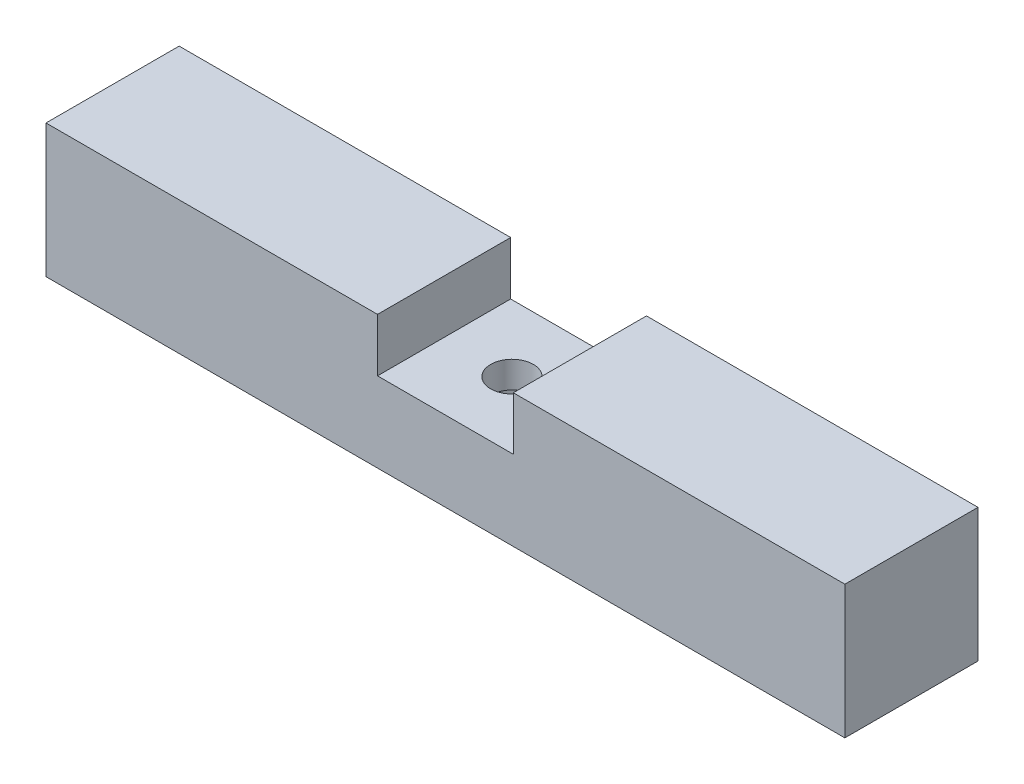
ISO-10303-21;
HEADER;
FILE_DESCRIPTION(('STEP AP214'),'2;1');
FILE_NAME('part.step','',(''),(''),'','','');
FILE_SCHEMA(('AUTOMOTIVE_DESIGN { 1 0 10303 214 1 1 1 1 }'));
ENDSEC;
DATA;
#1=APPLICATION_CONTEXT('core data for automotive mechanical design processes');
#2=APPLICATION_PROTOCOL_DEFINITION('international standard','automotive_design',2000,#1);
#3=PRODUCT_CONTEXT('',#1,'mechanical');
#4=PRODUCT('Part','Part','',(#3));
#5=PRODUCT_RELATED_PRODUCT_CATEGORY('part','',(#4));
#6=PRODUCT_DEFINITION_FORMATION('','',#4);
#7=PRODUCT_DEFINITION_CONTEXT('part definition',#1,'design');
#8=PRODUCT_DEFINITION('design','',#6,#7);
#9=PRODUCT_DEFINITION_SHAPE('','',#8);
#10=(LENGTH_UNIT() NAMED_UNIT(*) SI_UNIT(.MILLI.,.METRE.));
#11=(NAMED_UNIT(*) PLANE_ANGLE_UNIT() SI_UNIT($,.RADIAN.));
#12=(NAMED_UNIT(*) SI_UNIT($,.STERADIAN.) SOLID_ANGLE_UNIT());
#13=UNCERTAINTY_MEASURE_WITH_UNIT(LENGTH_MEASURE(1.E-05),#10,'distance_accuracy_value','');
#14=(GEOMETRIC_REPRESENTATION_CONTEXT(3) GLOBAL_UNCERTAINTY_ASSIGNED_CONTEXT((#13)) GLOBAL_UNIT_ASSIGNED_CONTEXT((#10,
#11,#12)) REPRESENTATION_CONTEXT('',''));
#15=CARTESIAN_POINT('',(0.,0.,0.));
#16=DIRECTION('',(0.,0.,1.));
#17=DIRECTION('',(1.,0.,0.));
#18=AXIS2_PLACEMENT_3D('',#15,#16,#17);
#19=CARTESIAN_POINT('',(0.,-4.,5.));
#20=DIRECTION('',(0.,1.,0.));
#21=DIRECTION('',(0.,0.,1.));
#22=AXIS2_PLACEMENT_3D('',#19,#20,#21);
#23=CYLINDRICAL_SURFACE('',#22,1.6);
#24=CARTESIAN_POINT('',(0.,6.,5.));
#25=DIRECTION('',(0.,1.,0.));
#26=DIRECTION('',(0.,0.,1.));
#27=AXIS2_PLACEMENT_3D('',#24,#25,#26);
#28=CIRCLE('',#27,1.6);
#29=CARTESIAN_POINT('',(0.,6.,6.6));
#30=VERTEX_POINT('',#29);
#31=EDGE_CURVE('E135',#30,#30,#28,.T.);
#32=ORIENTED_EDGE('',*,*,#31,.T.);
#33=EDGE_LOOP('',(#32));
#34=FACE_BOUND('',#33,.T.);
#35=CARTESIAN_POINT('',(0.,4.,5.));
#36=DIRECTION('',(0.,-1.,0.));
#37=DIRECTION('',(1.,0.,0.));
#38=AXIS2_PLACEMENT_3D('',#35,#36,#37);
#39=CIRCLE('',#38,1.6);
#40=CARTESIAN_POINT('',(1.6,4.,5.));
#41=VERTEX_POINT('',#40);
#42=EDGE_CURVE('E37',#41,#41,#39,.F.);
#43=ORIENTED_EDGE('',*,*,#42,.F.);
#44=EDGE_LOOP('',(#43));
#45=FACE_BOUND('',#44,.T.);
#46=ADVANCED_FACE('F33',(#34,#45),#23,.F.);
#47=CARTESIAN_POINT('',(-30.,0.,10.));
#48=DIRECTION('',(1.,0.,0.));
#49=DIRECTION('',(0.,0.,-1.));
#50=AXIS2_PLACEMENT_3D('',#47,#48,#49);
#51=PLANE('',#50);
#52=DIRECTION('',(0.,-1.,0.));
#53=VECTOR('',#52,1.);
#54=CARTESIAN_POINT('',(-30.,0.,0.));
#55=LINE('',#54,#53);
#56=CARTESIAN_POINT('',(-30.,10.,0.));
#57=VERTEX_POINT('',#56);
#58=CARTESIAN_POINT('',(-30.,0.,0.));
#59=VERTEX_POINT('',#58);
#60=EDGE_CURVE('E131',#57,#59,#55,.T.);
#61=ORIENTED_EDGE('',*,*,#60,.T.);
#62=DIRECTION('',(0.,0.,-1.));
#63=VECTOR('',#62,1.);
#64=CARTESIAN_POINT('',(-30.,0.,10.));
#65=LINE('',#64,#63);
#66=CARTESIAN_POINT('',(-30.,0.,10.));
#67=VERTEX_POINT('',#66);
#68=EDGE_CURVE('E11',#67,#59,#65,.T.);
#69=ORIENTED_EDGE('',*,*,#68,.F.);
#70=DIRECTION('',(0.,-1.,0.));
#71=VECTOR('',#70,1.);
#72=CARTESIAN_POINT('',(-30.,0.,10.));
#73=LINE('',#72,#71);
#74=CARTESIAN_POINT('',(-30.,10.,10.));
#75=VERTEX_POINT('',#74);
#76=EDGE_CURVE('E146',#75,#67,#73,.T.);
#77=ORIENTED_EDGE('',*,*,#76,.F.);
#78=DIRECTION('',(0.,0.,-1.));
#79=VECTOR('',#78,1.);
#80=CARTESIAN_POINT('',(-30.,10.,10.));
#81=LINE('',#80,#79);
#82=EDGE_CURVE('E127',#75,#57,#81,.T.);
#83=ORIENTED_EDGE('',*,*,#82,.T.);
#84=EDGE_LOOP('',(#61,#69,#77,#83));
#85=FACE_BOUND('',#84,.T.);
#86=ADVANCED_FACE('F35',(#85),#51,.F.);
#87=CARTESIAN_POINT('',(-30.,0.,10.));
#88=DIRECTION('',(0.,1.,0.));
#89=DIRECTION('',(-1.,0.,0.));
#90=AXIS2_PLACEMENT_3D('',#87,#88,#89);
#91=PLANE('',#90);
#92=CARTESIAN_POINT('',(0.,0.,5.));
#93=DIRECTION('',(0.,-1.,0.));
#94=DIRECTION('',(1.,0.,0.));
#95=AXIS2_PLACEMENT_3D('',#92,#93,#94);
#96=CIRCLE('',#95,3.);
#97=CARTESIAN_POINT('',(3.,0.,5.));
#98=VERTEX_POINT('',#97);
#99=EDGE_CURVE('E182',#98,#98,#96,.T.);
#100=ORIENTED_EDGE('',*,*,#99,.F.);
#101=EDGE_LOOP('',(#100));
#102=FACE_BOUND('',#101,.T.);
#103=DIRECTION('',(1.,0.,0.));
#104=VECTOR('',#103,1.);
#105=CARTESIAN_POINT('',(-30.,0.,0.));
#106=LINE('',#105,#104);
#107=CARTESIAN_POINT('',(30.,0.,0.));
#108=VERTEX_POINT('',#107);
#109=EDGE_CURVE('E134',#59,#108,#106,.T.);
#110=ORIENTED_EDGE('',*,*,#109,.T.);
#111=DIRECTION('',(0.,0.,-1.));
#112=VECTOR('',#111,1.);
#113=CARTESIAN_POINT('',(30.,0.,10.));
#114=LINE('',#113,#112);
#115=CARTESIAN_POINT('',(30.,0.,10.));
#116=VERTEX_POINT('',#115);
#117=EDGE_CURVE('E43',#116,#108,#114,.T.);
#118=ORIENTED_EDGE('',*,*,#117,.F.);
#119=DIRECTION('',(1.,0.,0.));
#120=VECTOR('',#119,1.);
#121=CARTESIAN_POINT('',(-30.,0.,10.));
#122=LINE('',#121,#120);
#123=EDGE_CURVE('E94',#67,#116,#122,.T.);
#124=ORIENTED_EDGE('',*,*,#123,.F.);
#125=ORIENTED_EDGE('',*,*,#68,.T.);
#126=EDGE_LOOP('',(#110,#118,#124,#125));
#127=FACE_BOUND('',#126,.T.);
#128=ADVANCED_FACE('F200',(#102,#127),#91,.F.);
#129=CARTESIAN_POINT('',(30.,0.,10.));
#130=DIRECTION('',(-1.,0.,0.));
#131=DIRECTION('',(0.,-1.,0.));
#132=AXIS2_PLACEMENT_3D('',#129,#130,#131);
#133=PLANE('',#132);
#134=DIRECTION('',(0.,1.,0.));
#135=VECTOR('',#134,1.);
#136=CARTESIAN_POINT('',(30.,0.,0.));
#137=LINE('',#136,#135);
#138=CARTESIAN_POINT('',(30.,10.,0.));
#139=VERTEX_POINT('',#138);
#140=EDGE_CURVE('E137',#108,#139,#137,.T.);
#141=ORIENTED_EDGE('',*,*,#140,.T.);
#142=DIRECTION('',(0.,0.,-1.));
#143=VECTOR('',#142,1.);
#144=CARTESIAN_POINT('',(30.,10.,10.));
#145=LINE('',#144,#143);
#146=CARTESIAN_POINT('',(30.,10.,10.));
#147=VERTEX_POINT('',#146);
#148=EDGE_CURVE('E153',#147,#139,#145,.T.);
#149=ORIENTED_EDGE('',*,*,#148,.F.);
#150=DIRECTION('',(0.,1.,0.));
#151=VECTOR('',#150,1.);
#152=CARTESIAN_POINT('',(30.,0.,10.));
#153=LINE('',#152,#151);
#154=EDGE_CURVE('E162',#116,#147,#153,.T.);
#155=ORIENTED_EDGE('',*,*,#154,.F.);
#156=ORIENTED_EDGE('',*,*,#117,.T.);
#157=EDGE_LOOP('',(#141,#149,#155,#156));
#158=FACE_BOUND('',#157,.T.);
#159=ADVANCED_FACE('F160',(#158),#133,.F.);
#160=CARTESIAN_POINT('',(5.1,10.,10.));
#161=DIRECTION('',(0.,-1.,0.));
#162=DIRECTION('',(1.,0.,0.));
#163=AXIS2_PLACEMENT_3D('',#160,#161,#162);
#164=PLANE('',#163);
#165=DIRECTION('',(-1.,0.,0.));
#166=VECTOR('',#165,1.);
#167=CARTESIAN_POINT('',(5.1,10.,0.));
#168=LINE('',#167,#166);
#169=CARTESIAN_POINT('',(5.1,10.,0.));
#170=VERTEX_POINT('',#169);
#171=EDGE_CURVE('E139',#139,#170,#168,.T.);
#172=ORIENTED_EDGE('',*,*,#171,.T.);
#173=DIRECTION('',(0.,0.,-1.));
#174=VECTOR('',#173,1.);
#175=CARTESIAN_POINT('',(5.1,10.,10.));
#176=LINE('',#175,#174);
#177=CARTESIAN_POINT('',(5.1,10.,10.));
#178=VERTEX_POINT('',#177);
#179=EDGE_CURVE('E150',#178,#170,#176,.T.);
#180=ORIENTED_EDGE('',*,*,#179,.F.);
#181=DIRECTION('',(-1.,0.,0.));
#182=VECTOR('',#181,1.);
#183=CARTESIAN_POINT('',(5.1,10.,10.));
#184=LINE('',#183,#182);
#185=EDGE_CURVE('E174',#147,#178,#184,.T.);
#186=ORIENTED_EDGE('',*,*,#185,.F.);
#187=ORIENTED_EDGE('',*,*,#148,.T.);
#188=EDGE_LOOP('',(#172,#180,#186,#187));
#189=FACE_BOUND('',#188,.T.);
#190=ADVANCED_FACE('F170',(#189),#164,.F.);
#191=CARTESIAN_POINT('',(5.1,6.,10.));
#192=DIRECTION('',(1.,0.,0.));
#193=DIRECTION('',(0.,1.,0.));
#194=AXIS2_PLACEMENT_3D('',#191,#192,#193);
#195=PLANE('',#194);
#196=DIRECTION('',(0.,-1.,0.));
#197=VECTOR('',#196,1.);
#198=CARTESIAN_POINT('',(5.1,6.,0.));
#199=LINE('',#198,#197);
#200=CARTESIAN_POINT('',(5.1,6.,0.));
#201=VERTEX_POINT('',#200);
#202=EDGE_CURVE('E141',#170,#201,#199,.T.);
#203=ORIENTED_EDGE('',*,*,#202,.T.);
#204=DIRECTION('',(0.,0.,-1.));
#205=VECTOR('',#204,1.);
#206=CARTESIAN_POINT('',(5.1,6.,10.));
#207=LINE('',#206,#205);
#208=CARTESIAN_POINT('',(5.1,6.,10.));
#209=VERTEX_POINT('',#208);
#210=EDGE_CURVE('E122',#209,#201,#207,.T.);
#211=ORIENTED_EDGE('',*,*,#210,.F.);
#212=DIRECTION('',(0.,-1.,0.));
#213=VECTOR('',#212,1.);
#214=CARTESIAN_POINT('',(5.1,6.,10.));
#215=LINE('',#214,#213);
#216=EDGE_CURVE('E113',#178,#209,#215,.T.);
#217=ORIENTED_EDGE('',*,*,#216,.F.);
#218=ORIENTED_EDGE('',*,*,#179,.T.);
#219=EDGE_LOOP('',(#203,#211,#217,#218));
#220=FACE_BOUND('',#219,.T.);
#221=ADVANCED_FACE('F173',(#220),#195,.F.);
#222=CARTESIAN_POINT('',(-5.1,6.,10.));
#223=DIRECTION('',(0.,-1.,0.));
#224=DIRECTION('',(1.,0.,0.));
#225=AXIS2_PLACEMENT_3D('',#222,#223,#224);
#226=PLANE('',#225);
#227=ORIENTED_EDGE('',*,*,#31,.F.);
#228=EDGE_LOOP('',(#227));
#229=FACE_BOUND('',#228,.T.);
#230=DIRECTION('',(-1.,0.,0.));
#231=VECTOR('',#230,1.);
#232=CARTESIAN_POINT('',(-5.1,6.,0.));
#233=LINE('',#232,#231);
#234=CARTESIAN_POINT('',(-5.1,6.,0.));
#235=VERTEX_POINT('',#234);
#236=EDGE_CURVE('E121',#201,#235,#233,.T.);
#237=ORIENTED_EDGE('',*,*,#236,.T.);
#238=DIRECTION('',(0.,0.,-1.));
#239=VECTOR('',#238,1.);
#240=CARTESIAN_POINT('',(-5.1,6.,10.));
#241=LINE('',#240,#239);
#242=CARTESIAN_POINT('',(-5.1,6.,10.));
#243=VERTEX_POINT('',#242);
#244=EDGE_CURVE('E118',#243,#235,#241,.T.);
#245=ORIENTED_EDGE('',*,*,#244,.F.);
#246=DIRECTION('',(-1.,0.,0.));
#247=VECTOR('',#246,1.);
#248=CARTESIAN_POINT('',(-5.1,6.,10.));
#249=LINE('',#248,#247);
#250=EDGE_CURVE('E107',#209,#243,#249,.T.);
#251=ORIENTED_EDGE('',*,*,#250,.F.);
#252=ORIENTED_EDGE('',*,*,#210,.T.);
#253=EDGE_LOOP('',(#237,#245,#251,#252));
#254=FACE_BOUND('',#253,.T.);
#255=ADVANCED_FACE('F119',(#229,#254),#226,.F.);
#256=CARTESIAN_POINT('',(-5.1,10.,10.));
#257=DIRECTION('',(-1.,0.,0.));
#258=DIRECTION('',(0.,-1.,0.));
#259=AXIS2_PLACEMENT_3D('',#256,#257,#258);
#260=PLANE('',#259);
#261=DIRECTION('',(0.,1.,0.));
#262=VECTOR('',#261,1.);
#263=CARTESIAN_POINT('',(-5.1,10.,0.));
#264=LINE('',#263,#262);
#265=CARTESIAN_POINT('',(-5.1,10.,0.));
#266=VERTEX_POINT('',#265);
#267=EDGE_CURVE('E80',#235,#266,#264,.T.);
#268=ORIENTED_EDGE('',*,*,#267,.T.);
#269=DIRECTION('',(0.,0.,-1.));
#270=VECTOR('',#269,1.);
#271=CARTESIAN_POINT('',(-5.1,10.,10.));
#272=LINE('',#271,#270);
#273=CARTESIAN_POINT('',(-5.1,10.,10.));
#274=VERTEX_POINT('',#273);
#275=EDGE_CURVE('E123',#274,#266,#272,.T.);
#276=ORIENTED_EDGE('',*,*,#275,.F.);
#277=DIRECTION('',(0.,1.,0.));
#278=VECTOR('',#277,1.);
#279=CARTESIAN_POINT('',(-5.1,10.,10.));
#280=LINE('',#279,#278);
#281=EDGE_CURVE('E111',#243,#274,#280,.T.);
#282=ORIENTED_EDGE('',*,*,#281,.F.);
#283=ORIENTED_EDGE('',*,*,#244,.T.);
#284=EDGE_LOOP('',(#268,#276,#282,#283));
#285=FACE_BOUND('',#284,.T.);
#286=ADVANCED_FACE('F125',(#285),#260,.F.);
#287=CARTESIAN_POINT('',(-30.,10.,10.));
#288=DIRECTION('',(0.,-1.,0.));
#289=DIRECTION('',(0.,0.,-1.));
#290=AXIS2_PLACEMENT_3D('',#287,#288,#289);
#291=PLANE('',#290);
#292=DIRECTION('',(-1.,0.,0.));
#293=VECTOR('',#292,1.);
#294=CARTESIAN_POINT('',(-30.,10.,0.));
#295=LINE('',#294,#293);
#296=EDGE_CURVE('E86',#266,#57,#295,.T.);
#297=ORIENTED_EDGE('',*,*,#296,.T.);
#298=ORIENTED_EDGE('',*,*,#82,.F.);
#299=DIRECTION('',(-1.,0.,0.));
#300=VECTOR('',#299,1.);
#301=CARTESIAN_POINT('',(-30.,10.,10.));
#302=LINE('',#301,#300);
#303=EDGE_CURVE('E51',#274,#75,#302,.T.);
#304=ORIENTED_EDGE('',*,*,#303,.F.);
#305=ORIENTED_EDGE('',*,*,#275,.T.);
#306=EDGE_LOOP('',(#297,#298,#304,#305));
#307=FACE_BOUND('',#306,.T.);
#308=ADVANCED_FACE('F208',(#307),#291,.F.);
#309=CARTESIAN_POINT('',(0.,0.,10.));
#310=DIRECTION('',(0.,0.,-1.));
#311=DIRECTION('',(-1.,0.,0.));
#312=AXIS2_PLACEMENT_3D('',#309,#310,#311);
#313=PLANE('',#312);
#314=ORIENTED_EDGE('',*,*,#76,.T.);
#315=ORIENTED_EDGE('',*,*,#123,.T.);
#316=ORIENTED_EDGE('',*,*,#154,.T.);
#317=ORIENTED_EDGE('',*,*,#185,.T.);
#318=ORIENTED_EDGE('',*,*,#216,.T.);
#319=ORIENTED_EDGE('',*,*,#250,.T.);
#320=ORIENTED_EDGE('',*,*,#281,.T.);
#321=ORIENTED_EDGE('',*,*,#303,.T.);
#322=EDGE_LOOP('',(#314,#315,#316,#317,#318,#319,#320,#321));
#323=FACE_BOUND('',#322,.T.);
#324=ADVANCED_FACE('F109',(#323),#313,.F.);
#325=CARTESIAN_POINT('',(0.,0.,0.));
#326=DIRECTION('',(0.,0.,-1.));
#327=DIRECTION('',(-1.,0.,0.));
#328=AXIS2_PLACEMENT_3D('',#325,#326,#327);
#329=PLANE('',#328);
#330=ORIENTED_EDGE('',*,*,#60,.F.);
#331=ORIENTED_EDGE('',*,*,#296,.F.);
#332=ORIENTED_EDGE('',*,*,#267,.F.);
#333=ORIENTED_EDGE('',*,*,#236,.F.);
#334=ORIENTED_EDGE('',*,*,#202,.F.);
#335=ORIENTED_EDGE('',*,*,#171,.F.);
#336=ORIENTED_EDGE('',*,*,#140,.F.);
#337=ORIENTED_EDGE('',*,*,#109,.F.);
#338=EDGE_LOOP('',(#330,#331,#332,#333,#334,#335,#336,#337));
#339=FACE_BOUND('',#338,.T.);
#340=ADVANCED_FACE('F166',(#339),#329,.T.);
#341=CARTESIAN_POINT('',(0.,4.,5.));
#342=DIRECTION('',(0.,-1.,0.));
#343=DIRECTION('',(1.,0.,0.));
#344=AXIS2_PLACEMENT_3D('',#341,#342,#343);
#345=PLANE('',#344);
#346=CARTESIAN_POINT('',(0.,4.,5.));
#347=DIRECTION('',(0.,-1.,0.));
#348=DIRECTION('',(1.,0.,0.));
#349=AXIS2_PLACEMENT_3D('',#346,#347,#348);
#350=CIRCLE('',#349,3.);
#351=CARTESIAN_POINT('',(3.,4.,5.));
#352=VERTEX_POINT('',#351);
#353=EDGE_CURVE('E185',#352,#352,#350,.T.);
#354=ORIENTED_EDGE('',*,*,#353,.T.);
#355=EDGE_LOOP('',(#354));
#356=FACE_BOUND('',#355,.T.);
#357=ORIENTED_EDGE('',*,*,#42,.T.);
#358=EDGE_LOOP('',(#357));
#359=FACE_BOUND('',#358,.T.);
#360=ADVANCED_FACE('F192',(#356,#359),#345,.T.);
#361=CARTESIAN_POINT('',(0.,4.,5.));
#362=DIRECTION('',(0.,-1.,0.));
#363=DIRECTION('',(1.,0.,0.));
#364=AXIS2_PLACEMENT_3D('',#361,#362,#363);
#365=CYLINDRICAL_SURFACE('',#364,3.);
#366=ORIENTED_EDGE('',*,*,#353,.F.);
#367=EDGE_LOOP('',(#366));
#368=FACE_BOUND('',#367,.T.);
#369=ORIENTED_EDGE('',*,*,#99,.T.);
#370=EDGE_LOOP('',(#369));
#371=FACE_BOUND('',#370,.T.);
#372=ADVANCED_FACE('F204',(#368,#371),#365,.F.);
#373=CLOSED_SHELL('',(#46,#86,#128,#159,#190,#221,#255,#286,#308,#324,#340,#360,#372));
#374=MANIFOLD_SOLID_BREP('B2',#373);
#375=ADVANCED_BREP_SHAPE_REPRESENTATION('',(#18,#374),#14);
#376=SHAPE_DEFINITION_REPRESENTATION(#9,#375);
ENDSEC;
END-ISO-10303-21;
